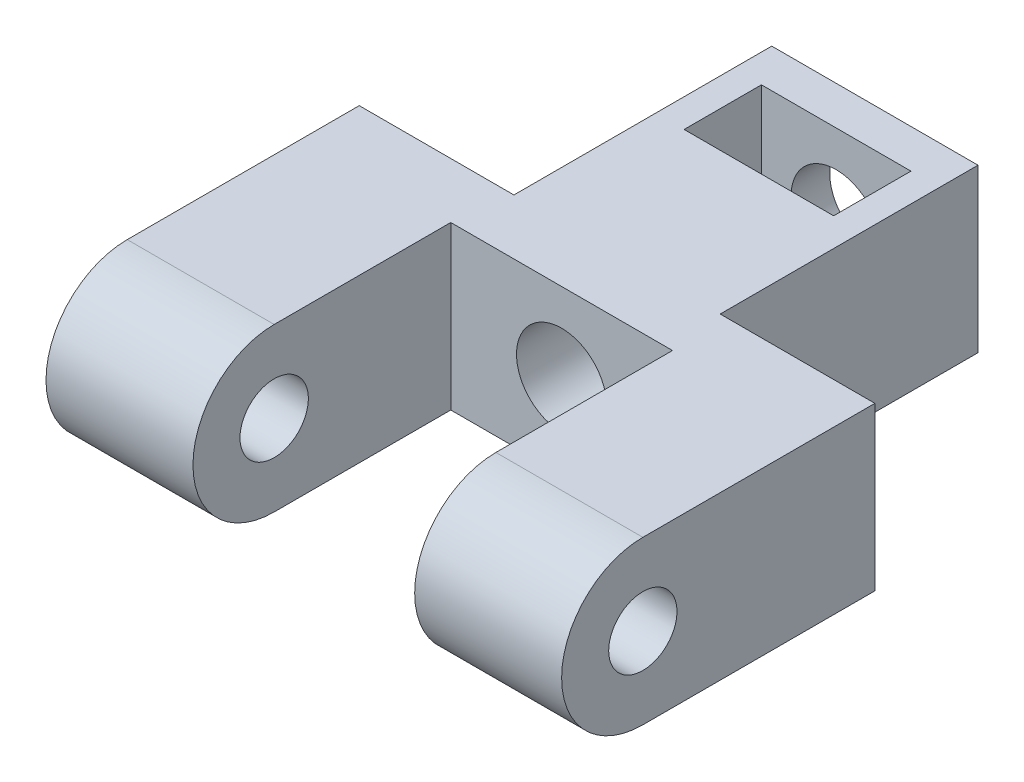
ISO-10303-21;
HEADER;
FILE_DESCRIPTION(('STEP AP214'),'2;1');
FILE_NAME('part.step','',(''),(''),'','','');
FILE_SCHEMA(('AUTOMOTIVE_DESIGN { 1 0 10303 214 1 1 1 1 }'));
ENDSEC;
DATA;
#1=APPLICATION_CONTEXT('core data for automotive mechanical design processes');
#2=APPLICATION_PROTOCOL_DEFINITION('international standard','automotive_design',2000,#1);
#3=PRODUCT_CONTEXT('',#1,'mechanical');
#4=PRODUCT('Part','Part','',(#3));
#5=PRODUCT_RELATED_PRODUCT_CATEGORY('part','',(#4));
#6=PRODUCT_DEFINITION_FORMATION('','',#4);
#7=PRODUCT_DEFINITION_CONTEXT('part definition',#1,'design');
#8=PRODUCT_DEFINITION('design','',#6,#7);
#9=PRODUCT_DEFINITION_SHAPE('','',#8);
#10=(LENGTH_UNIT() NAMED_UNIT(*) SI_UNIT(.MILLI.,.METRE.));
#11=(NAMED_UNIT(*) PLANE_ANGLE_UNIT() SI_UNIT($,.RADIAN.));
#12=(NAMED_UNIT(*) SI_UNIT($,.STERADIAN.) SOLID_ANGLE_UNIT());
#13=UNCERTAINTY_MEASURE_WITH_UNIT(LENGTH_MEASURE(1.E-05),#10,'distance_accuracy_value','');
#14=(GEOMETRIC_REPRESENTATION_CONTEXT(3) GLOBAL_UNCERTAINTY_ASSIGNED_CONTEXT((#13)) GLOBAL_UNIT_ASSIGNED_CONTEXT((#10,
#11,#12)) REPRESENTATION_CONTEXT('',''));
#15=CARTESIAN_POINT('',(0.,0.,0.));
#16=DIRECTION('',(0.,0.,1.));
#17=DIRECTION('',(1.,0.,0.));
#18=AXIS2_PLACEMENT_3D('',#15,#16,#17);
#19=CARTESIAN_POINT('',(0.,0.,10.));
#20=DIRECTION('',(0.,0.,-1.));
#21=DIRECTION('',(-1.,0.,0.));
#22=AXIS2_PLACEMENT_3D('',#19,#20,#21);
#23=CYLINDRICAL_SURFACE('',#22,1.75);
#24=CARTESIAN_POINT('',(0.,0.,1.5));
#25=DIRECTION('',(0.,0.,-1.));
#26=DIRECTION('',(-1.,0.,0.));
#27=AXIS2_PLACEMENT_3D('',#24,#25,#26);
#28=CIRCLE('',#27,1.75);
#29=CARTESIAN_POINT('',(-1.75,0.,1.5));
#30=VERTEX_POINT('',#29);
#31=EDGE_CURVE('E192',#30,#30,#28,.T.);
#32=ORIENTED_EDGE('',*,*,#31,.F.);
#33=EDGE_LOOP('',(#32));
#34=FACE_BOUND('',#33,.T.);
#35=CARTESIAN_POINT('',(0.,0.,0.));
#36=DIRECTION('',(0.,0.,1.));
#37=DIRECTION('',(1.,0.,0.));
#38=AXIS2_PLACEMENT_3D('',#35,#36,#37);
#39=CIRCLE('',#38,1.75);
#40=CARTESIAN_POINT('',(1.75,0.,0.));
#41=VERTEX_POINT('',#40);
#42=EDGE_CURVE('E265',#41,#41,#39,.T.);
#43=ORIENTED_EDGE('',*,*,#42,.F.);
#44=EDGE_LOOP('',(#43));
#45=FACE_BOUND('',#44,.T.);
#46=ADVANCED_FACE('F39',(#34,#45),#23,.F.);
#47=CARTESIAN_POINT('',(4.,3.15,10.));
#48=DIRECTION('',(0.,-1.,0.));
#49=DIRECTION('',(0.,0.,-1.));
#50=AXIS2_PLACEMENT_3D('',#47,#48,#49);
#51=PLANE('',#50);
#52=DIRECTION('',(1.,0.,0.));
#53=VECTOR('',#52,1.);
#54=CARTESIAN_POINT('',(-2.9,3.15,4.5));
#55=LINE('',#54,#53);
#56=CARTESIAN_POINT('',(-2.9,3.15,4.5));
#57=VERTEX_POINT('',#56);
#58=CARTESIAN_POINT('',(2.9,3.15,4.5));
#59=VERTEX_POINT('',#58);
#60=EDGE_CURVE('E177',#57,#59,#55,.T.);
#61=ORIENTED_EDGE('',*,*,#60,.F.);
#62=DIRECTION('',(0.,0.,1.));
#63=VECTOR('',#62,1.);
#64=CARTESIAN_POINT('',(-2.9,3.15,1.5));
#65=LINE('',#64,#63);
#66=CARTESIAN_POINT('',(-2.9,3.15,1.5));
#67=VERTEX_POINT('',#66);
#68=EDGE_CURVE('E53',#67,#57,#65,.T.);
#69=ORIENTED_EDGE('',*,*,#68,.F.);
#70=DIRECTION('',(-1.,0.,0.));
#71=VECTOR('',#70,1.);
#72=CARTESIAN_POINT('',(2.9,3.15,1.5));
#73=LINE('',#72,#71);
#74=CARTESIAN_POINT('',(2.9,3.15,1.5));
#75=VERTEX_POINT('',#74);
#76=EDGE_CURVE('E167',#75,#67,#73,.T.);
#77=ORIENTED_EDGE('',*,*,#76,.F.);
#78=DIRECTION('',(0.,0.,-1.));
#79=VECTOR('',#78,1.);
#80=CARTESIAN_POINT('',(2.9,3.15,4.5));
#81=LINE('',#80,#79);
#82=EDGE_CURVE('E173',#59,#75,#81,.T.);
#83=ORIENTED_EDGE('',*,*,#82,.F.);
#84=EDGE_LOOP('',(#61,#69,#77,#83));
#85=FACE_BOUND('',#84,.T.);
#86=DIRECTION('',(-1.,0.,0.));
#87=VECTOR('',#86,1.);
#88=CARTESIAN_POINT('',(10.,3.15,19.));
#89=LINE('',#88,#87);
#90=CARTESIAN_POINT('',(10.,3.15,19.));
#91=VERTEX_POINT('',#90);
#92=CARTESIAN_POINT('',(4.3,3.15,19.));
#93=VERTEX_POINT('',#92);
#94=EDGE_CURVE('E199',#91,#93,#89,.T.);
#95=ORIENTED_EDGE('',*,*,#94,.F.);
#96=DIRECTION('',(0.,0.,-1.));
#97=VECTOR('',#96,1.);
#98=CARTESIAN_POINT('',(10.,3.15,22.15));
#99=LINE('',#98,#97);
#100=CARTESIAN_POINT('',(10.,3.15,10.));
#101=VERTEX_POINT('',#100);
#102=EDGE_CURVE('E258',#91,#101,#99,.T.);
#103=ORIENTED_EDGE('',*,*,#102,.T.);
#104=DIRECTION('',(-1.,0.,0.));
#105=VECTOR('',#104,1.);
#106=CARTESIAN_POINT('',(-10.,3.15,10.));
#107=LINE('',#106,#105);
#108=CARTESIAN_POINT('',(4.,3.15,10.));
#109=VERTEX_POINT('',#108);
#110=EDGE_CURVE('E242',#101,#109,#107,.T.);
#111=ORIENTED_EDGE('',*,*,#110,.T.);
#112=DIRECTION('',(0.,0.,-1.));
#113=VECTOR('',#112,1.);
#114=CARTESIAN_POINT('',(4.,3.15,10.));
#115=LINE('',#114,#113);
#116=CARTESIAN_POINT('',(4.,3.15,0.));
#117=VERTEX_POINT('',#116);
#118=EDGE_CURVE('E271',#109,#117,#115,.T.);
#119=ORIENTED_EDGE('',*,*,#118,.T.);
#120=DIRECTION('',(-1.,0.,0.));
#121=VECTOR('',#120,1.);
#122=CARTESIAN_POINT('',(4.,3.15,0.));
#123=LINE('',#122,#121);
#124=CARTESIAN_POINT('',(-4.,3.15,0.));
#125=VERTEX_POINT('',#124);
#126=EDGE_CURVE('E264',#117,#125,#123,.T.);
#127=ORIENTED_EDGE('',*,*,#126,.T.);
#128=DIRECTION('',(0.,0.,-1.));
#129=VECTOR('',#128,1.);
#130=CARTESIAN_POINT('',(-4.,3.15,10.));
#131=LINE('',#130,#129);
#132=CARTESIAN_POINT('',(-4.,3.15,10.));
#133=VERTEX_POINT('',#132);
#134=EDGE_CURVE('E50',#133,#125,#131,.T.);
#135=ORIENTED_EDGE('',*,*,#134,.F.);
#136=CARTESIAN_POINT('',(-10.,3.15,10.));
#137=VERTEX_POINT('',#136);
#138=EDGE_CURVE('E243',#133,#137,#107,.T.);
#139=ORIENTED_EDGE('',*,*,#138,.T.);
#140=DIRECTION('',(0.,0.,-1.));
#141=VECTOR('',#140,1.);
#142=CARTESIAN_POINT('',(-10.,3.15,22.15));
#143=LINE('',#142,#141);
#144=CARTESIAN_POINT('',(-10.,3.15,19.));
#145=VERTEX_POINT('',#144);
#146=EDGE_CURVE('E259',#145,#137,#143,.T.);
#147=ORIENTED_EDGE('',*,*,#146,.F.);
#148=CARTESIAN_POINT('',(-4.3,3.15,19.));
#149=VERTEX_POINT('',#148);
#150=EDGE_CURVE('E205',#149,#145,#89,.T.);
#151=ORIENTED_EDGE('',*,*,#150,.F.);
#152=DIRECTION('',(0.,0.,1.));
#153=VECTOR('',#152,1.);
#154=CARTESIAN_POINT('',(-4.3,3.15,12.15));
#155=LINE('',#154,#153);
#156=CARTESIAN_POINT('',(-4.3,3.15,12.15));
#157=VERTEX_POINT('',#156);
#158=EDGE_CURVE('E226',#157,#149,#155,.T.);
#159=ORIENTED_EDGE('',*,*,#158,.F.);
#160=DIRECTION('',(-1.,0.,0.));
#161=VECTOR('',#160,1.);
#162=CARTESIAN_POINT('',(-4.3,3.15,12.15));
#163=LINE('',#162,#161);
#164=CARTESIAN_POINT('',(4.3,3.15,12.15));
#165=VERTEX_POINT('',#164);
#166=EDGE_CURVE('E215',#165,#157,#163,.T.);
#167=ORIENTED_EDGE('',*,*,#166,.F.);
#168=DIRECTION('',(0.,0.,1.));
#169=VECTOR('',#168,1.);
#170=CARTESIAN_POINT('',(4.3,3.15,12.15));
#171=LINE('',#170,#169);
#172=EDGE_CURVE('E219',#165,#93,#171,.T.);
#173=ORIENTED_EDGE('',*,*,#172,.T.);
#174=EDGE_LOOP('',(#95,#103,#111,#119,#127,#135,#139,#147,#151,#159,#167,#173));
#175=FACE_BOUND('',#174,.T.);
#176=ADVANCED_FACE('F41',(#85,#175),#51,.F.);
#177=CARTESIAN_POINT('',(10.,3.15,22.15));
#178=DIRECTION('',(-1.,0.,0.));
#179=DIRECTION('',(0.,-1.,0.));
#180=AXIS2_PLACEMENT_3D('',#177,#178,#179);
#181=PLANE('',#180);
#182=CARTESIAN_POINT('',(10.,0.,19.));
#183=DIRECTION('',(-1.,0.,0.));
#184=DIRECTION('',(0.,0.,1.));
#185=AXIS2_PLACEMENT_3D('',#182,#183,#184);
#186=CIRCLE('',#185,1.325);
#187=CARTESIAN_POINT('',(10.,0.,20.325));
#188=VERTEX_POINT('',#187);
#189=EDGE_CURVE('E231',#188,#188,#186,.T.);
#190=ORIENTED_EDGE('',*,*,#189,.T.);
#191=EDGE_LOOP('',(#190));
#192=FACE_BOUND('',#191,.T.);
#193=ORIENTED_EDGE('',*,*,#102,.F.);
#194=CARTESIAN_POINT('',(10.,0.,19.));
#195=DIRECTION('',(1.,0.,0.));
#196=DIRECTION('',(0.,0.,-1.));
#197=AXIS2_PLACEMENT_3D('',#194,#195,#196);
#198=CIRCLE('',#197,3.15);
#199=CARTESIAN_POINT('',(10.,-3.15,19.));
#200=VERTEX_POINT('',#199);
#201=EDGE_CURVE('E193',#91,#200,#198,.T.);
#202=ORIENTED_EDGE('',*,*,#201,.T.);
#203=DIRECTION('',(0.,0.,-1.));
#204=VECTOR('',#203,1.);
#205=CARTESIAN_POINT('',(10.,-3.15,22.15));
#206=LINE('',#205,#204);
#207=CARTESIAN_POINT('',(10.,-3.15,10.));
#208=VERTEX_POINT('',#207);
#209=EDGE_CURVE('E251',#200,#208,#206,.T.);
#210=ORIENTED_EDGE('',*,*,#209,.T.);
#211=DIRECTION('',(0.,1.,0.));
#212=VECTOR('',#211,1.);
#213=CARTESIAN_POINT('',(10.,3.15,10.));
#214=LINE('',#213,#212);
#215=EDGE_CURVE('E236',#208,#101,#214,.T.);
#216=ORIENTED_EDGE('',*,*,#215,.T.);
#217=EDGE_LOOP('',(#193,#202,#210,#216));
#218=FACE_BOUND('',#217,.T.);
#219=ADVANCED_FACE('F323',(#192,#218),#181,.F.);
#220=CARTESIAN_POINT('',(-4.3,3.15,12.15));
#221=DIRECTION('',(-1.,0.,0.));
#222=DIRECTION('',(0.,0.,1.));
#223=AXIS2_PLACEMENT_3D('',#220,#221,#222);
#224=PLANE('',#223);
#225=CARTESIAN_POINT('',(-4.3,0.,19.));
#226=DIRECTION('',(-1.,0.,0.));
#227=DIRECTION('',(0.,0.,1.));
#228=AXIS2_PLACEMENT_3D('',#225,#226,#227);
#229=CIRCLE('',#228,1.325);
#230=CARTESIAN_POINT('',(-4.3,0.,20.325));
#231=VERTEX_POINT('',#230);
#232=EDGE_CURVE('E291',#231,#231,#229,.F.);
#233=ORIENTED_EDGE('',*,*,#232,.F.);
#234=EDGE_LOOP('',(#233));
#235=FACE_BOUND('',#234,.T.);
#236=ORIENTED_EDGE('',*,*,#158,.T.);
#237=CARTESIAN_POINT('',(-4.3,0.,19.));
#238=DIRECTION('',(-1.,0.,0.));
#239=DIRECTION('',(0.,0.,1.));
#240=AXIS2_PLACEMENT_3D('',#237,#238,#239);
#241=CIRCLE('',#240,3.15);
#242=CARTESIAN_POINT('',(-4.3,-3.15,19.));
#243=VERTEX_POINT('',#242);
#244=EDGE_CURVE('E201',#149,#243,#241,.F.);
#245=ORIENTED_EDGE('',*,*,#244,.T.);
#246=DIRECTION('',(0.,0.,1.));
#247=VECTOR('',#246,1.);
#248=CARTESIAN_POINT('',(-4.3,-3.15,12.15));
#249=LINE('',#248,#247);
#250=CARTESIAN_POINT('',(-4.3,-3.15,12.15));
#251=VERTEX_POINT('',#250);
#252=EDGE_CURVE('E222',#251,#243,#249,.T.);
#253=ORIENTED_EDGE('',*,*,#252,.F.);
#254=DIRECTION('',(0.,-1.,0.));
#255=VECTOR('',#254,1.);
#256=CARTESIAN_POINT('',(-4.3,3.15,12.15));
#257=LINE('',#256,#255);
#258=EDGE_CURVE('E213',#157,#251,#257,.T.);
#259=ORIENTED_EDGE('',*,*,#258,.F.);
#260=EDGE_LOOP('',(#236,#245,#253,#259));
#261=FACE_BOUND('',#260,.T.);
#262=ADVANCED_FACE('F317',(#235,#261),#224,.F.);
#263=CARTESIAN_POINT('',(4.3,3.15,12.15));
#264=DIRECTION('',(1.,0.,0.));
#265=DIRECTION('',(0.,0.,-1.));
#266=AXIS2_PLACEMENT_3D('',#263,#264,#265);
#267=PLANE('',#266);
#268=CARTESIAN_POINT('',(4.3,0.,19.));
#269=DIRECTION('',(1.,0.,0.));
#270=DIRECTION('',(0.,0.,-1.));
#271=AXIS2_PLACEMENT_3D('',#268,#269,#270);
#272=CIRCLE('',#271,1.325);
#273=CARTESIAN_POINT('',(4.3,0.,17.675));
#274=VERTEX_POINT('',#273);
#275=EDGE_CURVE('E223',#274,#274,#272,.F.);
#276=ORIENTED_EDGE('',*,*,#275,.F.);
#277=EDGE_LOOP('',(#276));
#278=FACE_BOUND('',#277,.T.);
#279=DIRECTION('',(0.,0.,1.));
#280=VECTOR('',#279,1.);
#281=CARTESIAN_POINT('',(4.3,-3.15,12.15));
#282=LINE('',#281,#280);
#283=CARTESIAN_POINT('',(4.3,-3.15,12.15));
#284=VERTEX_POINT('',#283);
#285=CARTESIAN_POINT('',(4.3,-3.15,19.));
#286=VERTEX_POINT('',#285);
#287=EDGE_CURVE('E224',#284,#286,#282,.T.);
#288=ORIENTED_EDGE('',*,*,#287,.T.);
#289=CARTESIAN_POINT('',(4.3,0.,19.));
#290=DIRECTION('',(1.,0.,0.));
#291=DIRECTION('',(0.,0.,-1.));
#292=AXIS2_PLACEMENT_3D('',#289,#290,#291);
#293=CIRCLE('',#292,3.15);
#294=EDGE_CURVE('E11',#286,#93,#293,.F.);
#295=ORIENTED_EDGE('',*,*,#294,.T.);
#296=ORIENTED_EDGE('',*,*,#172,.F.);
#297=DIRECTION('',(0.,1.,0.));
#298=VECTOR('',#297,1.);
#299=CARTESIAN_POINT('',(4.3,3.15,12.15));
#300=LINE('',#299,#298);
#301=EDGE_CURVE('E209',#284,#165,#300,.T.);
#302=ORIENTED_EDGE('',*,*,#301,.F.);
#303=EDGE_LOOP('',(#288,#295,#296,#302));
#304=FACE_BOUND('',#303,.T.);
#305=ADVANCED_FACE('F318',(#278,#304),#267,.F.);
#306=CARTESIAN_POINT('',(0.,0.,4.5));
#307=DIRECTION('',(0.,0.,1.));
#308=DIRECTION('',(1.,0.,0.));
#309=AXIS2_PLACEMENT_3D('',#306,#307,#308);
#310=CIRCLE('',#309,1.75);
#311=CARTESIAN_POINT('',(1.75,0.,4.5));
#312=VERTEX_POINT('',#311);
#313=EDGE_CURVE('E184',#312,#312,#310,.T.);
#314=ORIENTED_EDGE('',*,*,#313,.F.);
#315=EDGE_LOOP('',(#314));
#316=FACE_BOUND('',#315,.T.);
#317=CARTESIAN_POINT('',(0.,0.,12.15));
#318=DIRECTION('',(0.,0.,1.));
#319=DIRECTION('',(1.,0.,0.));
#320=AXIS2_PLACEMENT_3D('',#317,#318,#319);
#321=CIRCLE('',#320,1.75);
#322=CARTESIAN_POINT('',(1.75,0.,12.15));
#323=VERTEX_POINT('',#322);
#324=EDGE_CURVE('E239',#323,#323,#321,.T.);
#325=ORIENTED_EDGE('',*,*,#324,.T.);
#326=EDGE_LOOP('',(#325));
#327=FACE_BOUND('',#326,.T.);
#328=ADVANCED_FACE('F296',(#316,#327),#23,.F.);
#329=CARTESIAN_POINT('',(0.,0.,0.));
#330=DIRECTION('',(0.,0.,-1.));
#331=DIRECTION('',(-1.,0.,0.));
#332=AXIS2_PLACEMENT_3D('',#329,#330,#331);
#333=PLANE('',#332);
#334=ORIENTED_EDGE('',*,*,#126,.F.);
#335=DIRECTION('',(0.,1.,0.));
#336=VECTOR('',#335,1.);
#337=CARTESIAN_POINT('',(4.,-3.15,0.));
#338=LINE('',#337,#336);
#339=CARTESIAN_POINT('',(4.,-3.15,0.));
#340=VERTEX_POINT('',#339);
#341=EDGE_CURVE('E267',#340,#117,#338,.T.);
#342=ORIENTED_EDGE('',*,*,#341,.F.);
#343=DIRECTION('',(1.,0.,0.));
#344=VECTOR('',#343,1.);
#345=CARTESIAN_POINT('',(4.,-3.15,0.));
#346=LINE('',#345,#344);
#347=CARTESIAN_POINT('',(-4.,-3.15,0.));
#348=VERTEX_POINT('',#347);
#349=EDGE_CURVE('E279',#348,#340,#346,.T.);
#350=ORIENTED_EDGE('',*,*,#349,.F.);
#351=DIRECTION('',(0.,-1.,0.));
#352=VECTOR('',#351,1.);
#353=CARTESIAN_POINT('',(-4.,-3.15,0.));
#354=LINE('',#353,#352);
#355=EDGE_CURVE('E277',#125,#348,#354,.T.);
#356=ORIENTED_EDGE('',*,*,#355,.F.);
#357=EDGE_LOOP('',(#334,#342,#350,#356));
#358=FACE_BOUND('',#357,.T.);
#359=ORIENTED_EDGE('',*,*,#42,.T.);
#360=EDGE_LOOP('',(#359));
#361=FACE_BOUND('',#360,.T.);
#362=ADVANCED_FACE('F340',(#358,#361),#333,.T.);
#363=CARTESIAN_POINT('',(-4.,-3.15,10.));
#364=DIRECTION('',(1.,0.,0.));
#365=DIRECTION('',(0.,0.,-1.));
#366=AXIS2_PLACEMENT_3D('',#363,#364,#365);
#367=PLANE('',#366);
#368=ORIENTED_EDGE('',*,*,#355,.T.);
#369=DIRECTION('',(0.,0.,-1.));
#370=VECTOR('',#369,1.);
#371=CARTESIAN_POINT('',(-4.,-3.15,10.));
#372=LINE('',#371,#370);
#373=CARTESIAN_POINT('',(-4.,-3.15,10.));
#374=VERTEX_POINT('',#373);
#375=EDGE_CURVE('E289',#374,#348,#372,.T.);
#376=ORIENTED_EDGE('',*,*,#375,.F.);
#377=DIRECTION('',(0.,-1.,0.));
#378=VECTOR('',#377,1.);
#379=CARTESIAN_POINT('',(-4.,-3.15,10.));
#380=LINE('',#379,#378);
#381=EDGE_CURVE('E269',#133,#374,#380,.T.);
#382=ORIENTED_EDGE('',*,*,#381,.F.);
#383=ORIENTED_EDGE('',*,*,#134,.T.);
#384=EDGE_LOOP('',(#368,#376,#382,#383));
#385=FACE_BOUND('',#384,.T.);
#386=ADVANCED_FACE('F342',(#385),#367,.F.);
#387=CARTESIAN_POINT('',(4.,-3.15,10.));
#388=DIRECTION('',(0.,1.,0.));
#389=DIRECTION('',(0.,0.,1.));
#390=AXIS2_PLACEMENT_3D('',#387,#388,#389);
#391=PLANE('',#390);
#392=DIRECTION('',(-1.,0.,0.));
#393=VECTOR('',#392,1.);
#394=CARTESIAN_POINT('',(2.9,-3.15,1.5));
#395=LINE('',#394,#393);
#396=CARTESIAN_POINT('',(2.9,-3.15,1.5));
#397=VERTEX_POINT('',#396);
#398=CARTESIAN_POINT('',(-2.9,-3.15,1.5));
#399=VERTEX_POINT('',#398);
#400=EDGE_CURVE('E157',#397,#399,#395,.T.);
#401=ORIENTED_EDGE('',*,*,#400,.T.);
#402=DIRECTION('',(0.,0.,1.));
#403=VECTOR('',#402,1.);
#404=CARTESIAN_POINT('',(-2.9,-3.15,1.5));
#405=LINE('',#404,#403);
#406=CARTESIAN_POINT('',(-2.9,-3.15,4.5));
#407=VERTEX_POINT('',#406);
#408=EDGE_CURVE('E153',#399,#407,#405,.T.);
#409=ORIENTED_EDGE('',*,*,#408,.T.);
#410=DIRECTION('',(1.,0.,0.));
#411=VECTOR('',#410,1.);
#412=CARTESIAN_POINT('',(-2.9,-3.15,4.5));
#413=LINE('',#412,#411);
#414=CARTESIAN_POINT('',(2.9,-3.15,4.5));
#415=VERTEX_POINT('',#414);
#416=EDGE_CURVE('E161',#407,#415,#413,.T.);
#417=ORIENTED_EDGE('',*,*,#416,.T.);
#418=DIRECTION('',(0.,0.,-1.));
#419=VECTOR('',#418,1.);
#420=CARTESIAN_POINT('',(2.9,-3.15,4.5));
#421=LINE('',#420,#419);
#422=EDGE_CURVE('E65',#415,#397,#421,.T.);
#423=ORIENTED_EDGE('',*,*,#422,.T.);
#424=EDGE_LOOP('',(#401,#409,#417,#423));
#425=FACE_BOUND('',#424,.T.);
#426=ORIENTED_EDGE('',*,*,#209,.F.);
#427=DIRECTION('',(-1.,0.,0.));
#428=VECTOR('',#427,1.);
#429=CARTESIAN_POINT('',(10.,-3.15,19.));
#430=LINE('',#429,#428);
#431=EDGE_CURVE('E203',#200,#286,#430,.T.);
#432=ORIENTED_EDGE('',*,*,#431,.T.);
#433=ORIENTED_EDGE('',*,*,#287,.F.);
#434=DIRECTION('',(1.,0.,0.));
#435=VECTOR('',#434,1.);
#436=CARTESIAN_POINT('',(-4.3,-3.15,12.15));
#437=LINE('',#436,#435);
#438=EDGE_CURVE('E220',#251,#284,#437,.T.);
#439=ORIENTED_EDGE('',*,*,#438,.F.);
#440=ORIENTED_EDGE('',*,*,#252,.T.);
#441=CARTESIAN_POINT('',(-10.,-3.15,19.));
#442=VERTEX_POINT('',#441);
#443=EDGE_CURVE('E197',#243,#442,#430,.T.);
#444=ORIENTED_EDGE('',*,*,#443,.T.);
#445=DIRECTION('',(0.,0.,-1.));
#446=VECTOR('',#445,1.);
#447=CARTESIAN_POINT('',(-10.,-3.15,22.15));
#448=LINE('',#447,#446);
#449=CARTESIAN_POINT('',(-10.,-3.15,10.));
#450=VERTEX_POINT('',#449);
#451=EDGE_CURVE('E257',#442,#450,#448,.T.);
#452=ORIENTED_EDGE('',*,*,#451,.T.);
#453=DIRECTION('',(1.,0.,0.));
#454=VECTOR('',#453,1.);
#455=CARTESIAN_POINT('',(-10.,-3.15,10.));
#456=LINE('',#455,#454);
#457=EDGE_CURVE('E252',#450,#374,#456,.T.);
#458=ORIENTED_EDGE('',*,*,#457,.T.);
#459=ORIENTED_EDGE('',*,*,#375,.T.);
#460=ORIENTED_EDGE('',*,*,#349,.T.);
#461=DIRECTION('',(0.,0.,-1.));
#462=VECTOR('',#461,1.);
#463=CARTESIAN_POINT('',(4.,-3.15,10.));
#464=LINE('',#463,#462);
#465=CARTESIAN_POINT('',(4.,-3.15,10.));
#466=VERTEX_POINT('',#465);
#467=EDGE_CURVE('E282',#466,#340,#464,.T.);
#468=ORIENTED_EDGE('',*,*,#467,.F.);
#469=EDGE_CURVE('E249',#466,#208,#456,.T.);
#470=ORIENTED_EDGE('',*,*,#469,.T.);
#471=EDGE_LOOP('',(#426,#432,#433,#439,#440,#444,#452,#458,#459,#460,#468,#470));
#472=FACE_BOUND('',#471,.T.);
#473=ADVANCED_FACE('F170',(#425,#472),#391,.F.);
#474=CARTESIAN_POINT('',(4.,-3.15,10.));
#475=DIRECTION('',(-1.,0.,0.));
#476=DIRECTION('',(0.,0.,1.));
#477=AXIS2_PLACEMENT_3D('',#474,#475,#476);
#478=PLANE('',#477);
#479=ORIENTED_EDGE('',*,*,#341,.T.);
#480=ORIENTED_EDGE('',*,*,#118,.F.);
#481=DIRECTION('',(0.,1.,0.));
#482=VECTOR('',#481,1.);
#483=CARTESIAN_POINT('',(4.,-3.15,10.));
#484=LINE('',#483,#482);
#485=EDGE_CURVE('E268',#466,#109,#484,.T.);
#486=ORIENTED_EDGE('',*,*,#485,.F.);
#487=ORIENTED_EDGE('',*,*,#467,.T.);
#488=EDGE_LOOP('',(#479,#480,#486,#487));
#489=FACE_BOUND('',#488,.T.);
#490=ADVANCED_FACE('F352',(#489),#478,.F.);
#491=CARTESIAN_POINT('',(0.,0.,10.));
#492=DIRECTION('',(0.,0.,1.));
#493=DIRECTION('',(1.,0.,0.));
#494=AXIS2_PLACEMENT_3D('',#491,#492,#493);
#495=PLANE('',#494);
#496=ORIENTED_EDGE('',*,*,#138,.F.);
#497=ORIENTED_EDGE('',*,*,#381,.T.);
#498=ORIENTED_EDGE('',*,*,#457,.F.);
#499=DIRECTION('',(0.,-1.,0.));
#500=VECTOR('',#499,1.);
#501=CARTESIAN_POINT('',(-10.,-3.15,10.));
#502=LINE('',#501,#500);
#503=EDGE_CURVE('E250',#137,#450,#502,.T.);
#504=ORIENTED_EDGE('',*,*,#503,.F.);
#505=EDGE_LOOP('',(#496,#497,#498,#504));
#506=FACE_BOUND('',#505,.T.);
#507=ADVANCED_FACE('F346',(#506),#495,.F.);
#508=ORIENTED_EDGE('',*,*,#469,.F.);
#509=ORIENTED_EDGE('',*,*,#485,.T.);
#510=ORIENTED_EDGE('',*,*,#110,.F.);
#511=ORIENTED_EDGE('',*,*,#215,.F.);
#512=EDGE_LOOP('',(#508,#509,#510,#511));
#513=FACE_BOUND('',#512,.T.);
#514=ADVANCED_FACE('F329',(#513),#495,.F.);
#515=CARTESIAN_POINT('',(-10.,-3.15,22.15));
#516=DIRECTION('',(1.,0.,0.));
#517=DIRECTION('',(0.,0.,-1.));
#518=AXIS2_PLACEMENT_3D('',#515,#516,#517);
#519=PLANE('',#518);
#520=CARTESIAN_POINT('',(-10.,0.,19.));
#521=DIRECTION('',(1.,0.,0.));
#522=DIRECTION('',(0.,0.,-1.));
#523=AXIS2_PLACEMENT_3D('',#520,#521,#522);
#524=CIRCLE('',#523,3.15);
#525=EDGE_CURVE('E191',#145,#442,#524,.T.);
#526=ORIENTED_EDGE('',*,*,#525,.F.);
#527=ORIENTED_EDGE('',*,*,#146,.T.);
#528=ORIENTED_EDGE('',*,*,#503,.T.);
#529=ORIENTED_EDGE('',*,*,#451,.F.);
#530=EDGE_LOOP('',(#526,#527,#528,#529));
#531=FACE_BOUND('',#530,.T.);
#532=CARTESIAN_POINT('',(-10.,0.,19.));
#533=DIRECTION('',(-1.,0.,0.));
#534=DIRECTION('',(0.,0.,1.));
#535=AXIS2_PLACEMENT_3D('',#532,#533,#534);
#536=CIRCLE('',#535,1.325);
#537=CARTESIAN_POINT('',(-10.,0.,20.325));
#538=VERTEX_POINT('',#537);
#539=EDGE_CURVE('E240',#538,#538,#536,.T.);
#540=ORIENTED_EDGE('',*,*,#539,.F.);
#541=EDGE_LOOP('',(#540));
#542=FACE_BOUND('',#541,.T.);
#543=ADVANCED_FACE('F354',(#531,#542),#519,.F.);
#544=CARTESIAN_POINT('',(10.,0.,19.));
#545=DIRECTION('',(-1.,0.,0.));
#546=DIRECTION('',(0.,0.,1.));
#547=AXIS2_PLACEMENT_3D('',#544,#545,#546);
#548=CYLINDRICAL_SURFACE('',#547,1.325);
#549=ORIENTED_EDGE('',*,*,#232,.T.);
#550=EDGE_LOOP('',(#549));
#551=FACE_BOUND('',#550,.T.);
#552=ORIENTED_EDGE('',*,*,#539,.T.);
#553=EDGE_LOOP('',(#552));
#554=FACE_BOUND('',#553,.T.);
#555=ADVANCED_FACE('F403',(#551,#554),#548,.F.);
#556=ORIENTED_EDGE('',*,*,#275,.T.);
#557=EDGE_LOOP('',(#556));
#558=FACE_BOUND('',#557,.T.);
#559=ORIENTED_EDGE('',*,*,#189,.F.);
#560=EDGE_LOOP('',(#559));
#561=FACE_BOUND('',#560,.T.);
#562=ADVANCED_FACE('F302',(#558,#561),#548,.F.);
#563=CARTESIAN_POINT('',(0.,0.,12.15));
#564=DIRECTION('',(0.,0.,1.));
#565=DIRECTION('',(1.,0.,0.));
#566=AXIS2_PLACEMENT_3D('',#563,#564,#565);
#567=PLANE('',#566);
#568=ORIENTED_EDGE('',*,*,#324,.F.);
#569=EDGE_LOOP('',(#568));
#570=FACE_BOUND('',#569,.T.);
#571=ORIENTED_EDGE('',*,*,#301,.T.);
#572=ORIENTED_EDGE('',*,*,#166,.T.);
#573=ORIENTED_EDGE('',*,*,#258,.T.);
#574=ORIENTED_EDGE('',*,*,#438,.T.);
#575=EDGE_LOOP('',(#571,#572,#573,#574));
#576=FACE_BOUND('',#575,.T.);
#577=ADVANCED_FACE('F297',(#570,#576),#567,.T.);
#578=CARTESIAN_POINT('',(10.,0.,19.));
#579=DIRECTION('',(-1.,0.,0.));
#580=DIRECTION('',(0.,0.,1.));
#581=AXIS2_PLACEMENT_3D('',#578,#579,#580);
#582=CYLINDRICAL_SURFACE('',#581,3.15);
#583=ORIENTED_EDGE('',*,*,#294,.F.);
#584=ORIENTED_EDGE('',*,*,#431,.F.);
#585=ORIENTED_EDGE('',*,*,#201,.F.);
#586=ORIENTED_EDGE('',*,*,#94,.T.);
#587=EDGE_LOOP('',(#583,#584,#585,#586));
#588=FACE_BOUND('',#587,.T.);
#589=ADVANCED_FACE('F303',(#588),#582,.T.);
#590=ORIENTED_EDGE('',*,*,#525,.T.);
#591=ORIENTED_EDGE('',*,*,#443,.F.);
#592=ORIENTED_EDGE('',*,*,#244,.F.);
#593=ORIENTED_EDGE('',*,*,#150,.T.);
#594=EDGE_LOOP('',(#590,#591,#592,#593));
#595=FACE_BOUND('',#594,.T.);
#596=ADVANCED_FACE('F353',(#595),#582,.T.);
#597=CARTESIAN_POINT('',(-2.9,-3.15,1.5));
#598=DIRECTION('',(-1.,0.,0.));
#599=DIRECTION('',(0.,0.,1.));
#600=AXIS2_PLACEMENT_3D('',#597,#598,#599);
#601=PLANE('',#600);
#602=ORIENTED_EDGE('',*,*,#68,.T.);
#603=DIRECTION('',(0.,1.,0.));
#604=VECTOR('',#603,1.);
#605=CARTESIAN_POINT('',(-2.9,-3.15,4.5));
#606=LINE('',#605,#604);
#607=EDGE_CURVE('E148',#407,#57,#606,.T.);
#608=ORIENTED_EDGE('',*,*,#607,.F.);
#609=ORIENTED_EDGE('',*,*,#408,.F.);
#610=DIRECTION('',(0.,1.,0.));
#611=VECTOR('',#610,1.);
#612=CARTESIAN_POINT('',(-2.9,-3.15,1.5));
#613=LINE('',#612,#611);
#614=EDGE_CURVE('E182',#399,#67,#613,.T.);
#615=ORIENTED_EDGE('',*,*,#614,.T.);
#616=EDGE_LOOP('',(#602,#608,#609,#615));
#617=FACE_BOUND('',#616,.T.);
#618=ADVANCED_FACE('F155',(#617),#601,.F.);
#619=CARTESIAN_POINT('',(2.9,-3.15,1.5));
#620=DIRECTION('',(0.,0.,-1.));
#621=DIRECTION('',(-1.,0.,0.));
#622=AXIS2_PLACEMENT_3D('',#619,#620,#621);
#623=PLANE('',#622);
#624=ORIENTED_EDGE('',*,*,#31,.T.);
#625=EDGE_LOOP('',(#624));
#626=FACE_BOUND('',#625,.T.);
#627=ORIENTED_EDGE('',*,*,#76,.T.);
#628=ORIENTED_EDGE('',*,*,#614,.F.);
#629=ORIENTED_EDGE('',*,*,#400,.F.);
#630=DIRECTION('',(0.,1.,0.));
#631=VECTOR('',#630,1.);
#632=CARTESIAN_POINT('',(2.9,-3.15,1.5));
#633=LINE('',#632,#631);
#634=EDGE_CURVE('E187',#397,#75,#633,.T.);
#635=ORIENTED_EDGE('',*,*,#634,.T.);
#636=EDGE_LOOP('',(#627,#628,#629,#635));
#637=FACE_BOUND('',#636,.T.);
#638=ADVANCED_FACE('F392',(#626,#637),#623,.F.);
#639=CARTESIAN_POINT('',(2.9,-3.15,4.5));
#640=DIRECTION('',(1.,0.,0.));
#641=DIRECTION('',(0.,0.,-1.));
#642=AXIS2_PLACEMENT_3D('',#639,#640,#641);
#643=PLANE('',#642);
#644=ORIENTED_EDGE('',*,*,#82,.T.);
#645=ORIENTED_EDGE('',*,*,#634,.F.);
#646=ORIENTED_EDGE('',*,*,#422,.F.);
#647=DIRECTION('',(0.,1.,0.));
#648=VECTOR('',#647,1.);
#649=CARTESIAN_POINT('',(2.9,-3.15,4.5));
#650=LINE('',#649,#648);
#651=EDGE_CURVE('E158',#415,#59,#650,.T.);
#652=ORIENTED_EDGE('',*,*,#651,.T.);
#653=EDGE_LOOP('',(#644,#645,#646,#652));
#654=FACE_BOUND('',#653,.T.);
#655=ADVANCED_FACE('F389',(#654),#643,.F.);
#656=CARTESIAN_POINT('',(-2.9,-3.15,4.5));
#657=DIRECTION('',(0.,0.,1.));
#658=DIRECTION('',(1.,0.,0.));
#659=AXIS2_PLACEMENT_3D('',#656,#657,#658);
#660=PLANE('',#659);
#661=ORIENTED_EDGE('',*,*,#313,.T.);
#662=EDGE_LOOP('',(#661));
#663=FACE_BOUND('',#662,.T.);
#664=ORIENTED_EDGE('',*,*,#60,.T.);
#665=ORIENTED_EDGE('',*,*,#651,.F.);
#666=ORIENTED_EDGE('',*,*,#416,.F.);
#667=ORIENTED_EDGE('',*,*,#607,.T.);
#668=EDGE_LOOP('',(#664,#665,#666,#667));
#669=FACE_BOUND('',#668,.T.);
#670=ADVANCED_FACE('F165',(#663,#669),#660,.F.);
#671=CLOSED_SHELL('',(#46,#176,#219,#262,#305,#328,#362,#386,#473,#490,#507,#514,#543,#555,#562,
#577,#589,#596,#618,#638,#655,#670));
#672=MANIFOLD_SOLID_BREP('B2',#671);
#673=ADVANCED_BREP_SHAPE_REPRESENTATION('',(#18,#672),#14);
#674=SHAPE_DEFINITION_REPRESENTATION(#9,#673);
ENDSEC;
END-ISO-10303-21;
